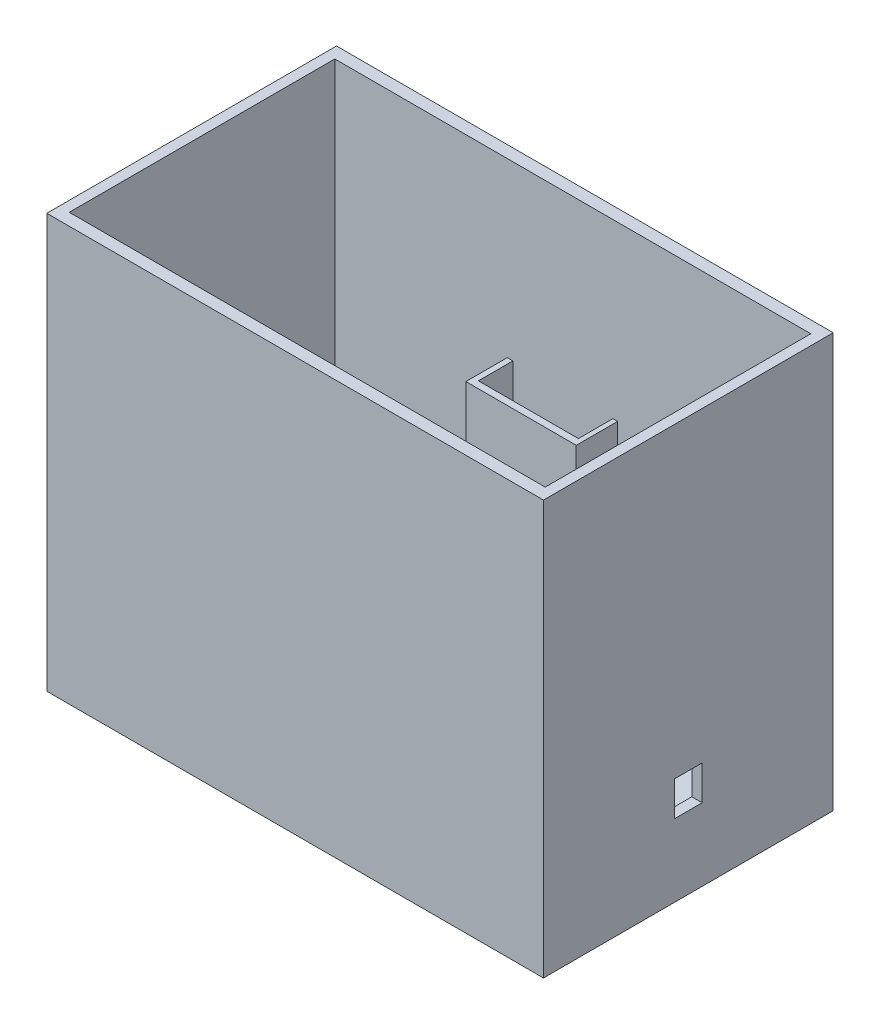
ISO-10303-21;
HEADER;
FILE_DESCRIPTION(('STEP AP214'),'2;1');
FILE_NAME('part.step','',(''),(''),'','','');
FILE_SCHEMA(('AUTOMOTIVE_DESIGN { 1 0 10303 214 1 1 1 1 }'));
ENDSEC;
DATA;
#1=APPLICATION_CONTEXT('core data for automotive mechanical design processes');
#2=APPLICATION_PROTOCOL_DEFINITION('international standard','automotive_design',2000,#1);
#3=PRODUCT_CONTEXT('',#1,'mechanical');
#4=PRODUCT('Part','Part','',(#3));
#5=PRODUCT_RELATED_PRODUCT_CATEGORY('part','',(#4));
#6=PRODUCT_DEFINITION_FORMATION('','',#4);
#7=PRODUCT_DEFINITION_CONTEXT('part definition',#1,'design');
#8=PRODUCT_DEFINITION('design','',#6,#7);
#9=PRODUCT_DEFINITION_SHAPE('','',#8);
#10=(LENGTH_UNIT() NAMED_UNIT(*) SI_UNIT(.MILLI.,.METRE.));
#11=(NAMED_UNIT(*) PLANE_ANGLE_UNIT() SI_UNIT($,.RADIAN.));
#12=(NAMED_UNIT(*) SI_UNIT($,.STERADIAN.) SOLID_ANGLE_UNIT());
#13=UNCERTAINTY_MEASURE_WITH_UNIT(LENGTH_MEASURE(1.E-05),#10,'distance_accuracy_value','');
#14=(GEOMETRIC_REPRESENTATION_CONTEXT(3) GLOBAL_UNCERTAINTY_ASSIGNED_CONTEXT((#13)) GLOBAL_UNIT_ASSIGNED_CONTEXT((#10,
#11,#12)) REPRESENTATION_CONTEXT('',''));
#15=CARTESIAN_POINT('',(0.,0.,0.));
#16=DIRECTION('',(0.,0.,1.));
#17=DIRECTION('',(1.,0.,0.));
#18=AXIS2_PLACEMENT_3D('',#15,#16,#17);
#19=CARTESIAN_POINT('',(-69.,20.,-38.5));
#20=DIRECTION('',(0.,0.,-1.));
#21=DIRECTION('',(-1.,0.,0.));
#22=AXIS2_PLACEMENT_3D('',#19,#20,#21);
#23=PLANE('',#22);
#24=DIRECTION('',(-1.,0.,0.));
#25=VECTOR('',#24,1.);
#26=CARTESIAN_POINT('',(-19.,70.,-38.5));
#27=LINE('',#26,#25);
#28=CARTESIAN_POINT('',(-17.3734135989396,70.,-38.5));
#29=VERTEX_POINT('',#28);
#30=CARTESIAN_POINT('',(-19.,70.,-38.5));
#31=VERTEX_POINT('',#30);
#32=EDGE_CURVE('E208',#29,#31,#27,.T.);
#33=ORIENTED_EDGE('',*,*,#32,.F.);
#34=DIRECTION('',(0.,1.,0.));
#35=VECTOR('',#34,1.);
#36=CARTESIAN_POINT('',(-17.3734135989396,25.,-38.5));
#37=LINE('',#36,#35);
#38=CARTESIAN_POINT('',(-17.3734135989396,25.,-38.5));
#39=VERTEX_POINT('',#38);
#40=EDGE_CURVE('E199',#39,#29,#37,.T.);
#41=ORIENTED_EDGE('',*,*,#40,.F.);
#42=DIRECTION('',(-1.,0.,0.));
#43=VECTOR('',#42,1.);
#44=CARTESIAN_POINT('',(-19.,25.,-38.5));
#45=LINE('',#44,#43);
#46=CARTESIAN_POINT('',(-19.,25.,-38.5));
#47=VERTEX_POINT('',#46);
#48=EDGE_CURVE('E189',#39,#47,#45,.T.);
#49=ORIENTED_EDGE('',*,*,#48,.T.);
#50=DIRECTION('',(0.,-1.,0.));
#51=VECTOR('',#50,1.);
#52=CARTESIAN_POINT('',(-19.,70.,-38.5));
#53=LINE('',#52,#51);
#54=EDGE_CURVE('E232',#31,#47,#53,.T.);
#55=ORIENTED_EDGE('',*,*,#54,.F.);
#56=EDGE_LOOP('',(#33,#41,#49,#55));
#57=FACE_BOUND('',#56,.T.);
#58=DIRECTION('',(-1.,0.,0.));
#59=VECTOR('',#58,1.);
#60=CARTESIAN_POINT('',(-69.,120.,-38.5));
#61=LINE('',#60,#59);
#62=CARTESIAN_POINT('',(69.,120.,-38.5));
#63=VERTEX_POINT('',#62);
#64=CARTESIAN_POINT('',(-69.,120.,-38.5));
#65=VERTEX_POINT('',#64);
#66=EDGE_CURVE('E281',#63,#65,#61,.T.);
#67=ORIENTED_EDGE('',*,*,#66,.T.);
#68=DIRECTION('',(0.,1.,0.));
#69=VECTOR('',#68,1.);
#70=CARTESIAN_POINT('',(-69.,20.,-38.5));
#71=LINE('',#70,#69);
#72=CARTESIAN_POINT('',(-69.,20.,-38.5));
#73=VERTEX_POINT('',#72);
#74=EDGE_CURVE('E294',#73,#65,#71,.T.);
#75=ORIENTED_EDGE('',*,*,#74,.F.);
#76=DIRECTION('',(-1.,0.,0.));
#77=VECTOR('',#76,1.);
#78=CARTESIAN_POINT('',(-69.,20.,-38.5));
#79=LINE('',#78,#77);
#80=CARTESIAN_POINT('',(69.,20.,-38.5));
#81=VERTEX_POINT('',#80);
#82=EDGE_CURVE('E268',#81,#73,#79,.T.);
#83=ORIENTED_EDGE('',*,*,#82,.F.);
#84=DIRECTION('',(0.,1.,0.));
#85=VECTOR('',#84,1.);
#86=CARTESIAN_POINT('',(69.,20.,-38.5));
#87=LINE('',#86,#85);
#88=EDGE_CURVE('E279',#81,#63,#87,.T.);
#89=ORIENTED_EDGE('',*,*,#88,.T.);
#90=EDGE_LOOP('',(#67,#75,#83,#89));
#91=FACE_BOUND('',#90,.T.);
#92=CARTESIAN_POINT('',(13.,70.,-38.5));
#93=VERTEX_POINT('',#92);
#94=CARTESIAN_POINT('',(11.6265864010604,70.,-38.5));
#95=VERTEX_POINT('',#94);
#96=EDGE_CURVE('E204',#93,#95,#27,.T.);
#97=ORIENTED_EDGE('',*,*,#96,.F.);
#98=DIRECTION('',(0.,-1.,0.));
#99=VECTOR('',#98,1.);
#100=CARTESIAN_POINT('',(13.,70.,-38.5));
#101=LINE('',#100,#99);
#102=CARTESIAN_POINT('',(13.,25.,-38.5));
#103=VERTEX_POINT('',#102);
#104=EDGE_CURVE('E214',#93,#103,#101,.T.);
#105=ORIENTED_EDGE('',*,*,#104,.T.);
#106=CARTESIAN_POINT('',(11.6265864010604,25.,-38.5));
#107=VERTEX_POINT('',#106);
#108=EDGE_CURVE('E215',#103,#107,#45,.T.);
#109=ORIENTED_EDGE('',*,*,#108,.T.);
#110=DIRECTION('',(0.,1.,0.));
#111=VECTOR('',#110,1.);
#112=CARTESIAN_POINT('',(11.6265864010604,25.,-38.5));
#113=LINE('',#112,#111);
#114=EDGE_CURVE('E201',#107,#95,#113,.T.);
#115=ORIENTED_EDGE('',*,*,#114,.T.);
#116=EDGE_LOOP('',(#97,#105,#109,#115));
#117=FACE_BOUND('',#116,.T.);
#118=ADVANCED_FACE('F33',(#57,#91,#117),#23,.F.);
#119=CARTESIAN_POINT('',(72.,120.,42.));
#120=DIRECTION('',(-1.,0.,0.));
#121=DIRECTION('',(0.,0.,1.));
#122=AXIS2_PLACEMENT_3D('',#119,#120,#121);
#123=PLANE('',#122);
#124=DIRECTION('',(0.,0.,-1.));
#125=VECTOR('',#124,1.);
#126=CARTESIAN_POINT('',(72.,31.,42.));
#127=LINE('',#126,#125);
#128=CARTESIAN_POINT('',(72.,31.,4.));
#129=VERTEX_POINT('',#128);
#130=CARTESIAN_POINT('',(72.,31.,-4.));
#131=VERTEX_POINT('',#130);
#132=EDGE_CURVE('E239',#129,#131,#127,.T.);
#133=ORIENTED_EDGE('',*,*,#132,.T.);
#134=DIRECTION('',(0.,-1.,0.));
#135=VECTOR('',#134,1.);
#136=CARTESIAN_POINT('',(72.,120.,-3.99999999999998));
#137=LINE('',#136,#135);
#138=CARTESIAN_POINT('',(72.,21.,-4.));
#139=VERTEX_POINT('',#138);
#140=EDGE_CURVE('E255',#131,#139,#137,.T.);
#141=ORIENTED_EDGE('',*,*,#140,.T.);
#142=DIRECTION('',(0.,0.,1.));
#143=VECTOR('',#142,1.);
#144=CARTESIAN_POINT('',(72.,21.,42.));
#145=LINE('',#144,#143);
#146=CARTESIAN_POINT('',(72.,21.,4.));
#147=VERTEX_POINT('',#146);
#148=EDGE_CURVE('E252',#139,#147,#145,.T.);
#149=ORIENTED_EDGE('',*,*,#148,.T.);
#150=DIRECTION('',(0.,1.,0.));
#151=VECTOR('',#150,1.);
#152=CARTESIAN_POINT('',(72.,120.,4.00000000000001));
#153=LINE('',#152,#151);
#154=EDGE_CURVE('E249',#147,#129,#153,.T.);
#155=ORIENTED_EDGE('',*,*,#154,.T.);
#156=EDGE_LOOP('',(#133,#141,#149,#155));
#157=FACE_BOUND('',#156,.T.);
#158=DIRECTION('',(0.,0.,-1.));
#159=VECTOR('',#158,1.);
#160=CARTESIAN_POINT('',(72.,0.,42.));
#161=LINE('',#160,#159);
#162=CARTESIAN_POINT('',(72.,0.,42.));
#163=VERTEX_POINT('',#162);
#164=CARTESIAN_POINT('',(72.,0.,-42.));
#165=VERTEX_POINT('',#164);
#166=EDGE_CURVE('E291',#163,#165,#161,.T.);
#167=ORIENTED_EDGE('',*,*,#166,.T.);
#168=DIRECTION('',(0.,-1.,0.));
#169=VECTOR('',#168,1.);
#170=CARTESIAN_POINT('',(72.,120.,-42.));
#171=LINE('',#170,#169);
#172=CARTESIAN_POINT('',(72.,120.,-42.));
#173=VERTEX_POINT('',#172);
#174=EDGE_CURVE('E324',#173,#165,#171,.T.);
#175=ORIENTED_EDGE('',*,*,#174,.F.);
#176=DIRECTION('',(0.,0.,-1.));
#177=VECTOR('',#176,1.);
#178=CARTESIAN_POINT('',(72.,120.,42.));
#179=LINE('',#178,#177);
#180=CARTESIAN_POINT('',(72.,120.,42.));
#181=VERTEX_POINT('',#180);
#182=EDGE_CURVE('E298',#181,#173,#179,.T.);
#183=ORIENTED_EDGE('',*,*,#182,.F.);
#184=DIRECTION('',(0.,-1.,0.));
#185=VECTOR('',#184,1.);
#186=CARTESIAN_POINT('',(72.,120.,42.));
#187=LINE('',#186,#185);
#188=EDGE_CURVE('E308',#181,#163,#187,.T.);
#189=ORIENTED_EDGE('',*,*,#188,.T.);
#190=EDGE_LOOP('',(#167,#175,#183,#189));
#191=FACE_BOUND('',#190,.T.);
#192=ADVANCED_FACE('F35',(#157,#191),#123,.F.);
#193=CARTESIAN_POINT('',(-72.,120.,-42.));
#194=DIRECTION('',(0.,0.,1.));
#195=DIRECTION('',(1.,0.,0.));
#196=AXIS2_PLACEMENT_3D('',#193,#194,#195);
#197=PLANE('',#196);
#198=DIRECTION('',(-1.,0.,0.));
#199=VECTOR('',#198,1.);
#200=CARTESIAN_POINT('',(-72.,0.,-42.));
#201=LINE('',#200,#199);
#202=CARTESIAN_POINT('',(-72.,0.,-42.));
#203=VERTEX_POINT('',#202);
#204=EDGE_CURVE('E311',#165,#203,#201,.T.);
#205=ORIENTED_EDGE('',*,*,#204,.T.);
#206=DIRECTION('',(0.,-1.,0.));
#207=VECTOR('',#206,1.);
#208=CARTESIAN_POINT('',(-72.,120.,-42.));
#209=LINE('',#208,#207);
#210=CARTESIAN_POINT('',(-72.,120.,-42.));
#211=VERTEX_POINT('',#210);
#212=EDGE_CURVE('E321',#211,#203,#209,.T.);
#213=ORIENTED_EDGE('',*,*,#212,.F.);
#214=DIRECTION('',(-1.,0.,0.));
#215=VECTOR('',#214,1.);
#216=CARTESIAN_POINT('',(-72.,120.,-42.));
#217=LINE('',#216,#215);
#218=EDGE_CURVE('E301',#173,#211,#217,.T.);
#219=ORIENTED_EDGE('',*,*,#218,.F.);
#220=ORIENTED_EDGE('',*,*,#174,.T.);
#221=EDGE_LOOP('',(#205,#213,#219,#220));
#222=FACE_BOUND('',#221,.T.);
#223=ADVANCED_FACE('F369',(#222),#197,.F.);
#224=CARTESIAN_POINT('',(-72.,120.,42.));
#225=DIRECTION('',(1.,0.,0.));
#226=DIRECTION('',(0.,0.,-1.));
#227=AXIS2_PLACEMENT_3D('',#224,#225,#226);
#228=PLANE('',#227);
#229=CARTESIAN_POINT('',(-72.,24.,-25.));
#230=DIRECTION('',(1.,0.,0.));
#231=DIRECTION('',(0.,0.,-1.));
#232=AXIS2_PLACEMENT_3D('',#229,#230,#231);
#233=CIRCLE('',#232,4.);
#234=CARTESIAN_POINT('',(-72.,24.,-29.));
#235=VERTEX_POINT('',#234);
#236=EDGE_CURVE('E261',#235,#235,#233,.T.);
#237=ORIENTED_EDGE('',*,*,#236,.T.);
#238=EDGE_LOOP('',(#237));
#239=FACE_BOUND('',#238,.T.);
#240=DIRECTION('',(0.,0.,1.));
#241=VECTOR('',#240,1.);
#242=CARTESIAN_POINT('',(-72.,0.,42.));
#243=LINE('',#242,#241);
#244=CARTESIAN_POINT('',(-72.,0.,42.));
#245=VERTEX_POINT('',#244);
#246=EDGE_CURVE('E313',#203,#245,#243,.T.);
#247=ORIENTED_EDGE('',*,*,#246,.T.);
#248=DIRECTION('',(0.,-1.,0.));
#249=VECTOR('',#248,1.);
#250=CARTESIAN_POINT('',(-72.,120.,42.));
#251=LINE('',#250,#249);
#252=CARTESIAN_POINT('',(-72.,120.,42.));
#253=VERTEX_POINT('',#252);
#254=EDGE_CURVE('E318',#253,#245,#251,.T.);
#255=ORIENTED_EDGE('',*,*,#254,.F.);
#256=DIRECTION('',(0.,0.,1.));
#257=VECTOR('',#256,1.);
#258=CARTESIAN_POINT('',(-72.,120.,42.));
#259=LINE('',#258,#257);
#260=EDGE_CURVE('E304',#211,#253,#259,.T.);
#261=ORIENTED_EDGE('',*,*,#260,.F.);
#262=ORIENTED_EDGE('',*,*,#212,.T.);
#263=EDGE_LOOP('',(#247,#255,#261,#262));
#264=FACE_BOUND('',#263,.T.);
#265=ADVANCED_FACE('F390',(#239,#264),#228,.F.);
#266=CARTESIAN_POINT('',(-72.,120.,42.));
#267=DIRECTION('',(0.,0.,-1.));
#268=DIRECTION('',(-1.,0.,0.));
#269=AXIS2_PLACEMENT_3D('',#266,#267,#268);
#270=PLANE('',#269);
#271=DIRECTION('',(1.,0.,0.));
#272=VECTOR('',#271,1.);
#273=CARTESIAN_POINT('',(-72.,0.,42.));
#274=LINE('',#273,#272);
#275=EDGE_CURVE('E302',#245,#163,#274,.T.);
#276=ORIENTED_EDGE('',*,*,#275,.T.);
#277=ORIENTED_EDGE('',*,*,#188,.F.);
#278=DIRECTION('',(1.,0.,0.));
#279=VECTOR('',#278,1.);
#280=CARTESIAN_POINT('',(-72.,120.,42.));
#281=LINE('',#280,#279);
#282=EDGE_CURVE('E306',#253,#181,#281,.T.);
#283=ORIENTED_EDGE('',*,*,#282,.F.);
#284=ORIENTED_EDGE('',*,*,#254,.T.);
#285=EDGE_LOOP('',(#276,#277,#283,#284));
#286=FACE_BOUND('',#285,.T.);
#287=ADVANCED_FACE('F383',(#286),#270,.F.);
#288=CARTESIAN_POINT('',(0.,120.,0.));
#289=DIRECTION('',(0.,-1.,0.));
#290=DIRECTION('',(0.,0.,-1.));
#291=AXIS2_PLACEMENT_3D('',#288,#289,#290);
#292=PLANE('',#291);
#293=ORIENTED_EDGE('',*,*,#66,.F.);
#294=DIRECTION('',(0.,0.,-1.));
#295=VECTOR('',#294,1.);
#296=CARTESIAN_POINT('',(69.,120.,38.5));
#297=LINE('',#296,#295);
#298=CARTESIAN_POINT('',(69.,120.,38.5));
#299=VERTEX_POINT('',#298);
#300=EDGE_CURVE('E264',#299,#63,#297,.T.);
#301=ORIENTED_EDGE('',*,*,#300,.F.);
#302=DIRECTION('',(1.,0.,0.));
#303=VECTOR('',#302,1.);
#304=CARTESIAN_POINT('',(-69.,120.,38.5));
#305=LINE('',#304,#303);
#306=CARTESIAN_POINT('',(-69.,120.,38.5));
#307=VERTEX_POINT('',#306);
#308=EDGE_CURVE('E269',#307,#299,#305,.T.);
#309=ORIENTED_EDGE('',*,*,#308,.F.);
#310=DIRECTION('',(0.,0.,1.));
#311=VECTOR('',#310,1.);
#312=CARTESIAN_POINT('',(-69.,120.,38.5));
#313=LINE('',#312,#311);
#314=EDGE_CURVE('E284',#65,#307,#313,.T.);
#315=ORIENTED_EDGE('',*,*,#314,.F.);
#316=EDGE_LOOP('',(#293,#301,#309,#315));
#317=FACE_BOUND('',#316,.T.);
#318=ORIENTED_EDGE('',*,*,#182,.T.);
#319=ORIENTED_EDGE('',*,*,#218,.T.);
#320=ORIENTED_EDGE('',*,*,#260,.T.);
#321=ORIENTED_EDGE('',*,*,#282,.T.);
#322=EDGE_LOOP('',(#318,#319,#320,#321));
#323=FACE_BOUND('',#322,.T.);
#324=ADVANCED_FACE('F380',(#317,#323),#292,.F.);
#325=CARTESIAN_POINT('',(0.,0.,0.));
#326=DIRECTION('',(0.,-1.,0.));
#327=DIRECTION('',(0.,0.,-1.));
#328=AXIS2_PLACEMENT_3D('',#325,#326,#327);
#329=PLANE('',#328);
#330=ORIENTED_EDGE('',*,*,#166,.F.);
#331=ORIENTED_EDGE('',*,*,#275,.F.);
#332=ORIENTED_EDGE('',*,*,#246,.F.);
#333=ORIENTED_EDGE('',*,*,#204,.F.);
#334=EDGE_LOOP('',(#330,#331,#332,#333));
#335=FACE_BOUND('',#334,.T.);
#336=ADVANCED_FACE('F379',(#335),#329,.T.);
#337=CARTESIAN_POINT('',(69.,20.,38.5));
#338=DIRECTION('',(1.,0.,0.));
#339=DIRECTION('',(0.,0.,-1.));
#340=AXIS2_PLACEMENT_3D('',#337,#338,#339);
#341=PLANE('',#340);
#342=DIRECTION('',(0.,0.,-1.));
#343=VECTOR('',#342,1.);
#344=CARTESIAN_POINT('',(69.,21.,38.5));
#345=LINE('',#344,#343);
#346=CARTESIAN_POINT('',(69.,21.,4.));
#347=VERTEX_POINT('',#346);
#348=CARTESIAN_POINT('',(69.,21.,-4.));
#349=VERTEX_POINT('',#348);
#350=EDGE_CURVE('E41',#347,#349,#345,.T.);
#351=ORIENTED_EDGE('',*,*,#350,.T.);
#352=DIRECTION('',(0.,1.,0.));
#353=VECTOR('',#352,1.);
#354=CARTESIAN_POINT('',(69.,20.,-4.));
#355=LINE('',#354,#353);
#356=CARTESIAN_POINT('',(69.,31.,-4.));
#357=VERTEX_POINT('',#356);
#358=EDGE_CURVE('E11',#349,#357,#355,.T.);
#359=ORIENTED_EDGE('',*,*,#358,.T.);
#360=DIRECTION('',(0.,0.,1.));
#361=VECTOR('',#360,1.);
#362=CARTESIAN_POINT('',(69.,31.,38.5));
#363=LINE('',#362,#361);
#364=CARTESIAN_POINT('',(69.,31.,4.));
#365=VERTEX_POINT('',#364);
#366=EDGE_CURVE('E327',#357,#365,#363,.T.);
#367=ORIENTED_EDGE('',*,*,#366,.T.);
#368=DIRECTION('',(0.,-1.,0.));
#369=VECTOR('',#368,1.);
#370=CARTESIAN_POINT('',(69.,20.,4.));
#371=LINE('',#370,#369);
#372=EDGE_CURVE('E330',#365,#347,#371,.T.);
#373=ORIENTED_EDGE('',*,*,#372,.T.);
#374=EDGE_LOOP('',(#351,#359,#367,#373));
#375=FACE_BOUND('',#374,.T.);
#376=ORIENTED_EDGE('',*,*,#300,.T.);
#377=ORIENTED_EDGE('',*,*,#88,.F.);
#378=DIRECTION('',(0.,0.,-1.));
#379=VECTOR('',#378,1.);
#380=CARTESIAN_POINT('',(69.,20.,38.5));
#381=LINE('',#380,#379);
#382=CARTESIAN_POINT('',(69.,20.,38.5));
#383=VERTEX_POINT('',#382);
#384=EDGE_CURVE('E265',#383,#81,#381,.T.);
#385=ORIENTED_EDGE('',*,*,#384,.F.);
#386=DIRECTION('',(0.,1.,0.));
#387=VECTOR('',#386,1.);
#388=CARTESIAN_POINT('',(69.,20.,38.5));
#389=LINE('',#388,#387);
#390=EDGE_CURVE('E289',#383,#299,#389,.T.);
#391=ORIENTED_EDGE('',*,*,#390,.T.);
#392=EDGE_LOOP('',(#376,#377,#385,#391));
#393=FACE_BOUND('',#392,.T.);
#394=ADVANCED_FACE('F334',(#375,#393),#341,.F.);
#395=CARTESIAN_POINT('',(-69.,20.,38.5));
#396=DIRECTION('',(0.,0.,1.));
#397=DIRECTION('',(1.,0.,0.));
#398=AXIS2_PLACEMENT_3D('',#395,#396,#397);
#399=PLANE('',#398);
#400=ORIENTED_EDGE('',*,*,#308,.T.);
#401=ORIENTED_EDGE('',*,*,#390,.F.);
#402=DIRECTION('',(1.,0.,0.));
#403=VECTOR('',#402,1.);
#404=CARTESIAN_POINT('',(-69.,20.,38.5));
#405=LINE('',#404,#403);
#406=CARTESIAN_POINT('',(-69.,20.,38.5));
#407=VERTEX_POINT('',#406);
#408=EDGE_CURVE('E276',#407,#383,#405,.T.);
#409=ORIENTED_EDGE('',*,*,#408,.F.);
#410=DIRECTION('',(0.,1.,0.));
#411=VECTOR('',#410,1.);
#412=CARTESIAN_POINT('',(-69.,20.,38.5));
#413=LINE('',#412,#411);
#414=EDGE_CURVE('E292',#407,#307,#413,.T.);
#415=ORIENTED_EDGE('',*,*,#414,.T.);
#416=EDGE_LOOP('',(#400,#401,#409,#415));
#417=FACE_BOUND('',#416,.T.);
#418=ADVANCED_FACE('F378',(#417),#399,.F.);
#419=CARTESIAN_POINT('',(-69.,20.,38.5));
#420=DIRECTION('',(-1.,0.,0.));
#421=DIRECTION('',(0.,0.,1.));
#422=AXIS2_PLACEMENT_3D('',#419,#420,#421);
#423=PLANE('',#422);
#424=DIRECTION('',(0.,0.,1.));
#425=VECTOR('',#424,1.);
#426=CARTESIAN_POINT('',(-69.,20.,38.5));
#427=LINE('',#426,#425);
#428=CARTESIAN_POINT('',(-69.,20.,-25.));
#429=VERTEX_POINT('',#428);
#430=EDGE_CURVE('E272',#429,#407,#427,.T.);
#431=ORIENTED_EDGE('',*,*,#430,.F.);
#432=CARTESIAN_POINT('',(-69.,24.,-25.));
#433=DIRECTION('',(-1.,0.,0.));
#434=DIRECTION('',(0.,0.,1.));
#435=AXIS2_PLACEMENT_3D('',#432,#433,#434);
#436=CIRCLE('',#435,4.);
#437=EDGE_CURVE('E258',#429,#429,#436,.T.);
#438=ORIENTED_EDGE('',*,*,#437,.T.);
#439=EDGE_CURVE('E273',#73,#429,#427,.T.);
#440=ORIENTED_EDGE('',*,*,#439,.F.);
#441=ORIENTED_EDGE('',*,*,#74,.T.);
#442=ORIENTED_EDGE('',*,*,#314,.T.);
#443=ORIENTED_EDGE('',*,*,#414,.F.);
#444=EDGE_LOOP('',(#431,#438,#440,#441,#442,#443));
#445=FACE_BOUND('',#444,.T.);
#446=ADVANCED_FACE('F374',(#445),#423,.F.);
#447=CARTESIAN_POINT('',(0.,20.,0.));
#448=DIRECTION('',(0.,-1.,0.));
#449=DIRECTION('',(0.,0.,-1.));
#450=AXIS2_PLACEMENT_3D('',#447,#448,#449);
#451=PLANE('',#450);
#452=ORIENTED_EDGE('',*,*,#439,.T.);
#453=ORIENTED_EDGE('',*,*,#430,.T.);
#454=ORIENTED_EDGE('',*,*,#408,.T.);
#455=ORIENTED_EDGE('',*,*,#384,.T.);
#456=ORIENTED_EDGE('',*,*,#82,.T.);
#457=EDGE_LOOP('',(#452,#453,#454,#455,#456));
#458=FACE_BOUND('',#457,.T.);
#459=ADVANCED_FACE('F445',(#458),#451,.F.);
#460=CARTESIAN_POINT('',(-22.,24.,-25.));
#461=DIRECTION('',(-1.,0.,0.));
#462=DIRECTION('',(0.,0.,1.));
#463=AXIS2_PLACEMENT_3D('',#460,#461,#462);
#464=CYLINDRICAL_SURFACE('',#463,4.);
#465=ORIENTED_EDGE('',*,*,#437,.F.);
#466=EDGE_LOOP('',(#465));
#467=FACE_BOUND('',#466,.T.);
#468=ORIENTED_EDGE('',*,*,#236,.F.);
#469=EDGE_LOOP('',(#468));
#470=FACE_BOUND('',#469,.T.);
#471=ADVANCED_FACE('F452',(#467,#470),#464,.F.);
#472=CARTESIAN_POINT('',(52.,31.,-4.));
#473=DIRECTION('',(0.,0.,-1.));
#474=DIRECTION('',(0.,1.,0.));
#475=AXIS2_PLACEMENT_3D('',#472,#473,#474);
#476=PLANE('',#475);
#477=DIRECTION('',(1.,0.,0.));
#478=VECTOR('',#477,1.);
#479=CARTESIAN_POINT('',(52.,31.,-4.));
#480=LINE('',#479,#478);
#481=EDGE_CURVE('E235',#357,#131,#480,.T.);
#482=ORIENTED_EDGE('',*,*,#481,.F.);
#483=ORIENTED_EDGE('',*,*,#358,.F.);
#484=DIRECTION('',(1.,0.,0.));
#485=VECTOR('',#484,1.);
#486=CARTESIAN_POINT('',(52.,21.,-4.));
#487=LINE('',#486,#485);
#488=EDGE_CURVE('E236',#349,#139,#487,.T.);
#489=ORIENTED_EDGE('',*,*,#488,.T.);
#490=ORIENTED_EDGE('',*,*,#140,.F.);
#491=EDGE_LOOP('',(#482,#483,#489,#490));
#492=FACE_BOUND('',#491,.T.);
#493=ADVANCED_FACE('F348',(#492),#476,.F.);
#494=CARTESIAN_POINT('',(52.,21.,4.));
#495=DIRECTION('',(0.,-1.,0.));
#496=DIRECTION('',(0.,0.,-1.));
#497=AXIS2_PLACEMENT_3D('',#494,#495,#496);
#498=PLANE('',#497);
#499=ORIENTED_EDGE('',*,*,#488,.F.);
#500=ORIENTED_EDGE('',*,*,#350,.F.);
#501=DIRECTION('',(1.,0.,0.));
#502=VECTOR('',#501,1.);
#503=CARTESIAN_POINT('',(52.,21.,4.));
#504=LINE('',#503,#502);
#505=EDGE_CURVE('E240',#347,#147,#504,.T.);
#506=ORIENTED_EDGE('',*,*,#505,.T.);
#507=ORIENTED_EDGE('',*,*,#148,.F.);
#508=EDGE_LOOP('',(#499,#500,#506,#507));
#509=FACE_BOUND('',#508,.T.);
#510=ADVANCED_FACE('F340',(#509),#498,.F.);
#511=CARTESIAN_POINT('',(52.,31.,4.));
#512=DIRECTION('',(0.,0.,1.));
#513=DIRECTION('',(0.,-1.,0.));
#514=AXIS2_PLACEMENT_3D('',#511,#512,#513);
#515=PLANE('',#514);
#516=ORIENTED_EDGE('',*,*,#505,.F.);
#517=ORIENTED_EDGE('',*,*,#372,.F.);
#518=DIRECTION('',(1.,0.,0.));
#519=VECTOR('',#518,1.);
#520=CARTESIAN_POINT('',(52.,31.,4.));
#521=LINE('',#520,#519);
#522=EDGE_CURVE('E243',#365,#129,#521,.T.);
#523=ORIENTED_EDGE('',*,*,#522,.T.);
#524=ORIENTED_EDGE('',*,*,#154,.F.);
#525=EDGE_LOOP('',(#516,#517,#523,#524));
#526=FACE_BOUND('',#525,.T.);
#527=ADVANCED_FACE('F342',(#526),#515,.F.);
#528=CARTESIAN_POINT('',(52.,31.,4.));
#529=DIRECTION('',(0.,1.,0.));
#530=DIRECTION('',(0.,0.,1.));
#531=AXIS2_PLACEMENT_3D('',#528,#529,#530);
#532=PLANE('',#531);
#533=ORIENTED_EDGE('',*,*,#522,.F.);
#534=ORIENTED_EDGE('',*,*,#366,.F.);
#535=ORIENTED_EDGE('',*,*,#481,.T.);
#536=ORIENTED_EDGE('',*,*,#132,.F.);
#537=EDGE_LOOP('',(#533,#534,#535,#536));
#538=FACE_BOUND('',#537,.T.);
#539=ADVANCED_FACE('F350',(#538),#532,.F.);
#540=CARTESIAN_POINT('',(-19.,70.,-38.5));
#541=DIRECTION('',(1.,0.,0.));
#542=DIRECTION('',(0.,0.,-1.));
#543=AXIS2_PLACEMENT_3D('',#540,#541,#542);
#544=PLANE('',#543);
#545=DIRECTION('',(0.,0.,1.));
#546=VECTOR('',#545,1.);
#547=CARTESIAN_POINT('',(-19.,25.,-38.5));
#548=LINE('',#547,#546);
#549=CARTESIAN_POINT('',(-19.,25.,-26.5));
#550=VERTEX_POINT('',#549);
#551=EDGE_CURVE('E218',#47,#550,#548,.T.);
#552=ORIENTED_EDGE('',*,*,#551,.T.);
#553=DIRECTION('',(0.,-1.,0.));
#554=VECTOR('',#553,1.);
#555=CARTESIAN_POINT('',(-19.,70.,-26.5));
#556=LINE('',#555,#554);
#557=CARTESIAN_POINT('',(-19.,70.,-26.5));
#558=VERTEX_POINT('',#557);
#559=EDGE_CURVE('E229',#558,#550,#556,.T.);
#560=ORIENTED_EDGE('',*,*,#559,.F.);
#561=DIRECTION('',(0.,0.,1.));
#562=VECTOR('',#561,1.);
#563=CARTESIAN_POINT('',(-19.,70.,-38.5));
#564=LINE('',#563,#562);
#565=EDGE_CURVE('E207',#31,#558,#564,.T.);
#566=ORIENTED_EDGE('',*,*,#565,.F.);
#567=ORIENTED_EDGE('',*,*,#54,.T.);
#568=EDGE_LOOP('',(#552,#560,#566,#567));
#569=FACE_BOUND('',#568,.T.);
#570=ADVANCED_FACE('F352',(#569),#544,.F.);
#571=CARTESIAN_POINT('',(-19.,70.,-26.5));
#572=DIRECTION('',(0.,0.,-1.));
#573=DIRECTION('',(-1.,0.,0.));
#574=AXIS2_PLACEMENT_3D('',#571,#572,#573);
#575=PLANE('',#574);
#576=DIRECTION('',(1.,0.,0.));
#577=VECTOR('',#576,1.);
#578=CARTESIAN_POINT('',(-19.,25.,-26.5));
#579=LINE('',#578,#577);
#580=CARTESIAN_POINT('',(13.,25.,-26.5));
#581=VERTEX_POINT('',#580);
#582=EDGE_CURVE('E220',#550,#581,#579,.T.);
#583=ORIENTED_EDGE('',*,*,#582,.T.);
#584=DIRECTION('',(0.,-1.,0.));
#585=VECTOR('',#584,1.);
#586=CARTESIAN_POINT('',(13.,70.,-26.5));
#587=LINE('',#586,#585);
#588=CARTESIAN_POINT('',(13.,70.,-26.5));
#589=VERTEX_POINT('',#588);
#590=EDGE_CURVE('E226',#589,#581,#587,.T.);
#591=ORIENTED_EDGE('',*,*,#590,.F.);
#592=DIRECTION('',(1.,0.,0.));
#593=VECTOR('',#592,1.);
#594=CARTESIAN_POINT('',(-19.,70.,-26.5));
#595=LINE('',#594,#593);
#596=EDGE_CURVE('E210',#558,#589,#595,.T.);
#597=ORIENTED_EDGE('',*,*,#596,.F.);
#598=ORIENTED_EDGE('',*,*,#559,.T.);
#599=EDGE_LOOP('',(#583,#591,#597,#598));
#600=FACE_BOUND('',#599,.T.);
#601=ADVANCED_FACE('F358',(#600),#575,.F.);
#602=CARTESIAN_POINT('',(13.,70.,-38.5));
#603=DIRECTION('',(-1.,0.,0.));
#604=DIRECTION('',(0.,0.,1.));
#605=AXIS2_PLACEMENT_3D('',#602,#603,#604);
#606=PLANE('',#605);
#607=DIRECTION('',(0.,0.,-1.));
#608=VECTOR('',#607,1.);
#609=CARTESIAN_POINT('',(13.,25.,-38.5));
#610=LINE('',#609,#608);
#611=EDGE_CURVE('E222',#581,#103,#610,.T.);
#612=ORIENTED_EDGE('',*,*,#611,.T.);
#613=ORIENTED_EDGE('',*,*,#104,.F.);
#614=DIRECTION('',(0.,0.,-1.));
#615=VECTOR('',#614,1.);
#616=CARTESIAN_POINT('',(13.,70.,-38.5));
#617=LINE('',#616,#615);
#618=EDGE_CURVE('E212',#589,#93,#617,.T.);
#619=ORIENTED_EDGE('',*,*,#618,.F.);
#620=ORIENTED_EDGE('',*,*,#590,.T.);
#621=EDGE_LOOP('',(#612,#613,#619,#620));
#622=FACE_BOUND('',#621,.T.);
#623=ADVANCED_FACE('F495',(#622),#606,.F.);
#624=CARTESIAN_POINT('',(0.,70.,0.));
#625=DIRECTION('',(0.,-1.,0.));
#626=DIRECTION('',(0.,0.,-1.));
#627=AXIS2_PLACEMENT_3D('',#624,#625,#626);
#628=PLANE('',#627);
#629=DIRECTION('',(1.,0.,0.));
#630=VECTOR('',#629,1.);
#631=CARTESIAN_POINT('',(11.6265864010604,70.,-28.5));
#632=LINE('',#631,#630);
#633=CARTESIAN_POINT('',(-17.3734135989396,70.,-28.5));
#634=VERTEX_POINT('',#633);
#635=CARTESIAN_POINT('',(11.6265864010604,70.,-28.5));
#636=VERTEX_POINT('',#635);
#637=EDGE_CURVE('E193',#634,#636,#632,.T.);
#638=ORIENTED_EDGE('',*,*,#637,.F.);
#639=DIRECTION('',(0.,0.,1.));
#640=VECTOR('',#639,1.);
#641=CARTESIAN_POINT('',(-17.3734135989396,70.,-38.5));
#642=LINE('',#641,#640);
#643=EDGE_CURVE('E48',#29,#634,#642,.T.);
#644=ORIENTED_EDGE('',*,*,#643,.F.);
#645=ORIENTED_EDGE('',*,*,#32,.T.);
#646=ORIENTED_EDGE('',*,*,#565,.T.);
#647=ORIENTED_EDGE('',*,*,#596,.T.);
#648=ORIENTED_EDGE('',*,*,#618,.T.);
#649=ORIENTED_EDGE('',*,*,#96,.T.);
#650=DIRECTION('',(0.,0.,-1.));
#651=VECTOR('',#650,1.);
#652=CARTESIAN_POINT('',(11.6265864010604,70.,-38.5));
#653=LINE('',#652,#651);
#654=EDGE_CURVE('E190',#636,#95,#653,.T.);
#655=ORIENTED_EDGE('',*,*,#654,.F.);
#656=EDGE_LOOP('',(#638,#644,#645,#646,#647,#648,#649,#655));
#657=FACE_BOUND('',#656,.T.);
#658=ADVANCED_FACE('F504',(#657),#628,.F.);
#659=CARTESIAN_POINT('',(0.,25.,0.));
#660=DIRECTION('',(0.,-1.,0.));
#661=DIRECTION('',(0.,0.,-1.));
#662=AXIS2_PLACEMENT_3D('',#659,#660,#661);
#663=PLANE('',#662);
#664=DIRECTION('',(0.,0.,1.));
#665=VECTOR('',#664,1.);
#666=CARTESIAN_POINT('',(-17.3734135989396,25.,-38.5));
#667=LINE('',#666,#665);
#668=CARTESIAN_POINT('',(-17.3734135989396,25.,-28.5));
#669=VERTEX_POINT('',#668);
#670=EDGE_CURVE('E175',#39,#669,#667,.T.);
#671=ORIENTED_EDGE('',*,*,#670,.T.);
#672=DIRECTION('',(1.,0.,0.));
#673=VECTOR('',#672,1.);
#674=CARTESIAN_POINT('',(11.6265864010604,25.,-28.5));
#675=LINE('',#674,#673);
#676=CARTESIAN_POINT('',(11.6265864010604,25.,-28.5));
#677=VERTEX_POINT('',#676);
#678=EDGE_CURVE('E183',#669,#677,#675,.T.);
#679=ORIENTED_EDGE('',*,*,#678,.T.);
#680=DIRECTION('',(0.,0.,-1.));
#681=VECTOR('',#680,1.);
#682=CARTESIAN_POINT('',(11.6265864010604,25.,-38.5));
#683=LINE('',#682,#681);
#684=EDGE_CURVE('E56',#677,#107,#683,.T.);
#685=ORIENTED_EDGE('',*,*,#684,.T.);
#686=ORIENTED_EDGE('',*,*,#108,.F.);
#687=ORIENTED_EDGE('',*,*,#611,.F.);
#688=ORIENTED_EDGE('',*,*,#582,.F.);
#689=ORIENTED_EDGE('',*,*,#551,.F.);
#690=ORIENTED_EDGE('',*,*,#48,.F.);
#691=EDGE_LOOP('',(#671,#679,#685,#686,#687,#688,#689,#690));
#692=FACE_BOUND('',#691,.T.);
#693=ADVANCED_FACE('F187',(#692),#663,.T.);
#694=CARTESIAN_POINT('',(-17.3734135989396,25.,-38.5));
#695=DIRECTION('',(-1.,0.,0.));
#696=DIRECTION('',(0.,0.,1.));
#697=AXIS2_PLACEMENT_3D('',#694,#695,#696);
#698=PLANE('',#697);
#699=ORIENTED_EDGE('',*,*,#643,.T.);
#700=DIRECTION('',(0.,1.,0.));
#701=VECTOR('',#700,1.);
#702=CARTESIAN_POINT('',(-17.3734135989396,25.,-28.5));
#703=LINE('',#702,#701);
#704=EDGE_CURVE('E171',#669,#634,#703,.T.);
#705=ORIENTED_EDGE('',*,*,#704,.F.);
#706=ORIENTED_EDGE('',*,*,#670,.F.);
#707=ORIENTED_EDGE('',*,*,#40,.T.);
#708=EDGE_LOOP('',(#699,#705,#706,#707));
#709=FACE_BOUND('',#708,.T.);
#710=ADVANCED_FACE('F173',(#709),#698,.F.);
#711=CARTESIAN_POINT('',(11.6265864010604,25.,-38.5));
#712=DIRECTION('',(1.,0.,0.));
#713=DIRECTION('',(0.,0.,-1.));
#714=AXIS2_PLACEMENT_3D('',#711,#712,#713);
#715=PLANE('',#714);
#716=ORIENTED_EDGE('',*,*,#654,.T.);
#717=ORIENTED_EDGE('',*,*,#114,.F.);
#718=ORIENTED_EDGE('',*,*,#684,.F.);
#719=DIRECTION('',(0.,1.,0.));
#720=VECTOR('',#719,1.);
#721=CARTESIAN_POINT('',(11.6265864010604,25.,-28.5));
#722=LINE('',#721,#720);
#723=EDGE_CURVE('E180',#677,#636,#722,.T.);
#724=ORIENTED_EDGE('',*,*,#723,.T.);
#725=EDGE_LOOP('',(#716,#717,#718,#724));
#726=FACE_BOUND('',#725,.T.);
#727=ADVANCED_FACE('F536',(#726),#715,.F.);
#728=CARTESIAN_POINT('',(11.6265864010604,25.,-28.5));
#729=DIRECTION('',(0.,0.,1.));
#730=DIRECTION('',(1.,0.,0.));
#731=AXIS2_PLACEMENT_3D('',#728,#729,#730);
#732=PLANE('',#731);
#733=ORIENTED_EDGE('',*,*,#637,.T.);
#734=ORIENTED_EDGE('',*,*,#723,.F.);
#735=ORIENTED_EDGE('',*,*,#678,.F.);
#736=ORIENTED_EDGE('',*,*,#704,.T.);
#737=EDGE_LOOP('',(#733,#734,#735,#736));
#738=FACE_BOUND('',#737,.T.);
#739=ADVANCED_FACE('F184',(#738),#732,.F.);
#740=CLOSED_SHELL('',(#118,#192,#223,#265,#287,#324,#336,#394,#418,#446,#459,#471,#493,#510,
#527,#539,#570,#601,#623,#658,#693,#710,#727,#739));
#741=MANIFOLD_SOLID_BREP('B2',#740);
#742=ADVANCED_BREP_SHAPE_REPRESENTATION('',(#18,#741),#14);
#743=SHAPE_DEFINITION_REPRESENTATION(#9,#742);
ENDSEC;
END-ISO-10303-21;
